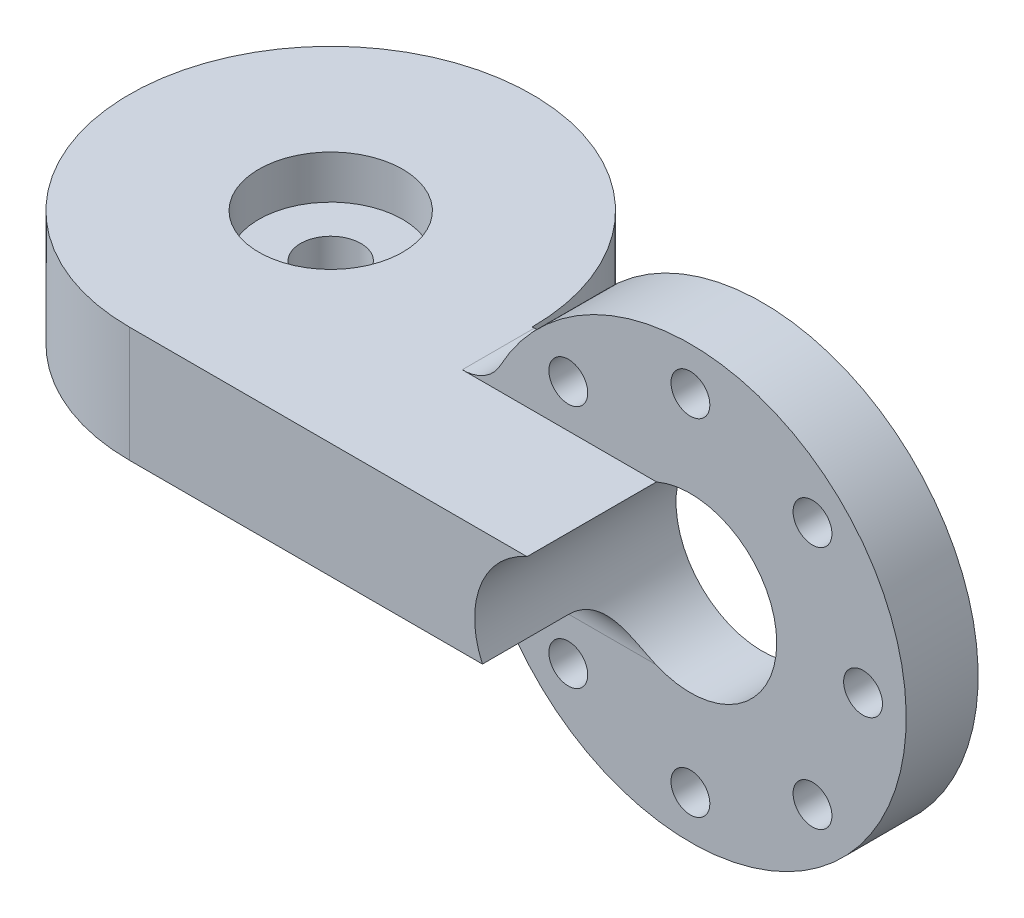
ISO-10303-21;
HEADER;
FILE_DESCRIPTION(('STEP AP214'),'2;1');
FILE_NAME('part.step','',(''),(''),'','','');
FILE_SCHEMA(('AUTOMOTIVE_DESIGN { 1 0 10303 214 1 1 1 1 }'));
ENDSEC;
DATA;
#1=APPLICATION_CONTEXT('core data for automotive mechanical design processes');
#2=APPLICATION_PROTOCOL_DEFINITION('international standard','automotive_design',2000,#1);
#3=PRODUCT_CONTEXT('',#1,'mechanical');
#4=PRODUCT('Part','Part','',(#3));
#5=PRODUCT_RELATED_PRODUCT_CATEGORY('part','',(#4));
#6=PRODUCT_DEFINITION_FORMATION('','',#4);
#7=PRODUCT_DEFINITION_CONTEXT('part definition',#1,'design');
#8=PRODUCT_DEFINITION('design','',#6,#7);
#9=PRODUCT_DEFINITION_SHAPE('','',#8);
#10=(LENGTH_UNIT() NAMED_UNIT(*) SI_UNIT(.MILLI.,.METRE.));
#11=(NAMED_UNIT(*) PLANE_ANGLE_UNIT() SI_UNIT($,.RADIAN.));
#12=(NAMED_UNIT(*) SI_UNIT($,.STERADIAN.) SOLID_ANGLE_UNIT());
#13=UNCERTAINTY_MEASURE_WITH_UNIT(LENGTH_MEASURE(1.E-05),#10,'distance_accuracy_value','');
#14=(GEOMETRIC_REPRESENTATION_CONTEXT(3) GLOBAL_UNCERTAINTY_ASSIGNED_CONTEXT((#13)) GLOBAL_UNIT_ASSIGNED_CONTEXT((#10,
#11,#12)) REPRESENTATION_CONTEXT('',''));
#15=CARTESIAN_POINT('',(0.,0.,0.));
#16=DIRECTION('',(0.,0.,1.));
#17=DIRECTION('',(1.,0.,0.));
#18=AXIS2_PLACEMENT_3D('',#15,#16,#17);
#19=CARTESIAN_POINT('',(0.,0.,0.));
#20=DIRECTION('',(0.,0.,1.));
#21=DIRECTION('',(1.,0.,0.));
#22=AXIS2_PLACEMENT_3D('',#19,#20,#21);
#23=PLANE('',#22);
#24=CARTESIAN_POINT('',(30.,12.,0.));
#25=DIRECTION('',(0.,0.,1.));
#26=DIRECTION('',(1.,0.,0.));
#27=AXIS2_PLACEMENT_3D('',#24,#25,#26);
#28=CIRCLE('',#27,1.35);
#29=CARTESIAN_POINT('',(31.35,12.,0.));
#30=VERTEX_POINT('',#29);
#31=EDGE_CURVE('E171',#30,#30,#28,.T.);
#32=ORIENTED_EDGE('',*,*,#31,.T.);
#33=EDGE_LOOP('',(#32));
#34=FACE_BOUND('',#33,.T.);
#35=CARTESIAN_POINT('',(38.4852813742388,8.48528137423903,0.));
#36=DIRECTION('',(0.,0.,1.));
#37=DIRECTION('',(1.,0.,0.));
#38=AXIS2_PLACEMENT_3D('',#35,#36,#37);
#39=CIRCLE('',#38,1.35);
#40=CARTESIAN_POINT('',(39.8352813742388,8.48528137423903,0.));
#41=VERTEX_POINT('',#40);
#42=EDGE_CURVE('E234',#41,#41,#39,.T.);
#43=ORIENTED_EDGE('',*,*,#42,.T.);
#44=EDGE_LOOP('',(#43));
#45=FACE_BOUND('',#44,.T.);
#46=CARTESIAN_POINT('',(42.0000000000007,6.38378239159465E-13,0.));
#47=DIRECTION('',(0.,0.,1.));
#48=DIRECTION('',(1.,0.,0.));
#49=AXIS2_PLACEMENT_3D('',#46,#47,#48);
#50=CIRCLE('',#49,1.35);
#51=CARTESIAN_POINT('',(43.3500000000007,6.38378239159465E-13,0.));
#52=VERTEX_POINT('',#51);
#53=EDGE_CURVE('E230',#52,#52,#50,.T.);
#54=ORIENTED_EDGE('',*,*,#53,.T.);
#55=EDGE_LOOP('',(#54));
#56=FACE_BOUND('',#55,.T.);
#57=CARTESIAN_POINT('',(38.4852813742397,-8.48528137423813,0.));
#58=DIRECTION('',(0.,0.,1.));
#59=DIRECTION('',(1.,0.,0.));
#60=AXIS2_PLACEMENT_3D('',#57,#58,#59);
#61=CIRCLE('',#60,1.35);
#62=CARTESIAN_POINT('',(39.8352813742397,-8.48528137423813,0.));
#63=VERTEX_POINT('',#62);
#64=EDGE_CURVE('E226',#63,#63,#61,.T.);
#65=ORIENTED_EDGE('',*,*,#64,.T.);
#66=EDGE_LOOP('',(#65));
#67=FACE_BOUND('',#66,.T.);
#68=CARTESIAN_POINT('',(30.0000000000013,-12.,0.));
#69=DIRECTION('',(0.,0.,1.));
#70=DIRECTION('',(1.,0.,0.));
#71=AXIS2_PLACEMENT_3D('',#68,#69,#70);
#72=CIRCLE('',#71,1.35);
#73=CARTESIAN_POINT('',(31.3500000000013,-12.,0.));
#74=VERTEX_POINT('',#73);
#75=EDGE_CURVE('E222',#74,#74,#72,.T.);
#76=ORIENTED_EDGE('',*,*,#75,.T.);
#77=EDGE_LOOP('',(#76));
#78=FACE_BOUND('',#77,.T.);
#79=CARTESIAN_POINT('',(21.5147186257625,-8.48528137423898,0.));
#80=DIRECTION('',(0.,0.,1.));
#81=DIRECTION('',(1.,0.,0.));
#82=AXIS2_PLACEMENT_3D('',#79,#80,#81);
#83=CIRCLE('',#82,1.35);
#84=CARTESIAN_POINT('',(22.8647186257625,-8.48528137423898,0.));
#85=VERTEX_POINT('',#84);
#86=EDGE_CURVE('E218',#85,#85,#83,.T.);
#87=ORIENTED_EDGE('',*,*,#86,.T.);
#88=EDGE_LOOP('',(#87));
#89=FACE_BOUND('',#88,.T.);
#90=CARTESIAN_POINT('',(21.5147186257617,8.48528137423818,0.));
#91=DIRECTION('',(0.,0.,1.));
#92=DIRECTION('',(1.,0.,0.));
#93=AXIS2_PLACEMENT_3D('',#90,#91,#92);
#94=CIRCLE('',#93,1.35);
#95=CARTESIAN_POINT('',(22.8647186257617,8.48528137423818,0.));
#96=VERTEX_POINT('',#95);
#97=EDGE_CURVE('E214',#96,#96,#94,.T.);
#98=ORIENTED_EDGE('',*,*,#97,.T.);
#99=EDGE_LOOP('',(#98));
#100=FACE_BOUND('',#99,.T.);
#101=CARTESIAN_POINT('',(30.,0.,0.));
#102=DIRECTION('',(0.,0.,1.));
#103=DIRECTION('',(1.,0.,0.));
#104=AXIS2_PLACEMENT_3D('',#101,#102,#103);
#105=CIRCLE('',#104,6.);
#106=CARTESIAN_POINT('',(36.,0.,0.));
#107=VERTEX_POINT('',#106);
#108=EDGE_CURVE('E166',#107,#107,#105,.T.);
#109=ORIENTED_EDGE('',*,*,#108,.T.);
#110=EDGE_LOOP('',(#109));
#111=FACE_BOUND('',#110,.T.);
#112=DIRECTION('',(0.,-1.,0.));
#113=VECTOR('',#112,1.);
#114=CARTESIAN_POINT('',(14.,2.5,0.));
#115=LINE('',#114,#113);
#116=CARTESIAN_POINT('',(14.,-2.5,0.));
#117=VERTEX_POINT('',#116);
#118=CARTESIAN_POINT('',(14.,5.517643060859,0.));
#119=VERTEX_POINT('',#118);
#120=EDGE_CURVE('E66',#117,#119,#115,.F.);
#121=ORIENTED_EDGE('',*,*,#120,.T.);
#122=DIRECTION('',(1.,0.,0.));
#123=VECTOR('',#122,1.);
#124=CARTESIAN_POINT('',(0.,5.517643060859,0.));
#125=LINE('',#124,#123);
#126=CARTESIAN_POINT('',(14.1428326398502,5.517643060859,0.));
#127=VERTEX_POINT('',#126);
#128=EDGE_CURVE('E147',#119,#127,#125,.T.);
#129=ORIENTED_EDGE('',*,*,#128,.T.);
#130=CARTESIAN_POINT('',(14.1428326398502,8.517643060859,0.));
#131=DIRECTION('',(0.,0.,1.));
#132=DIRECTION('',(1.,0.,0.));
#133=AXIS2_PLACEMENT_3D('',#130,#131,#132);
#134=CIRCLE('',#133,3.);
#135=CARTESIAN_POINT('',(16.7856938665418,7.09803588404917,0.));
#136=VERTEX_POINT('',#135);
#137=EDGE_CURVE('E271',#127,#136,#134,.T.);
#138=ORIENTED_EDGE('',*,*,#137,.T.);
#139=CARTESIAN_POINT('',(30.,0.,0.));
#140=DIRECTION('',(0.,0.,1.));
#141=DIRECTION('',(1.,0.,0.));
#142=AXIS2_PLACEMENT_3D('',#139,#140,#141);
#143=CIRCLE('',#142,15.);
#144=CARTESIAN_POINT('',(15.3632859412538,-3.28125,0.));
#145=VERTEX_POINT('',#144);
#146=EDGE_CURVE('E206',#145,#136,#143,.T.);
#147=ORIENTED_EDGE('',*,*,#146,.F.);
#148=CARTESIAN_POINT('',(14.387505004004,-3.5,0.));
#149=DIRECTION('',(0.,0.,1.));
#150=DIRECTION('',(1.,0.,0.));
#151=AXIS2_PLACEMENT_3D('',#148,#149,#150);
#152=CIRCLE('',#151,1.);
#153=CARTESIAN_POINT('',(14.387505004004,-2.5,0.));
#154=VERTEX_POINT('',#153);
#155=EDGE_CURVE('E59',#145,#154,#152,.T.);
#156=ORIENTED_EDGE('',*,*,#155,.T.);
#157=DIRECTION('',(-1.,0.,0.));
#158=VECTOR('',#157,1.);
#159=CARTESIAN_POINT('',(0.,-2.5,0.));
#160=LINE('',#159,#158);
#161=EDGE_CURVE('E211',#154,#117,#160,.T.);
#162=ORIENTED_EDGE('',*,*,#161,.T.);
#163=EDGE_LOOP('',(#121,#129,#138,#147,#156,#162));
#164=FACE_BOUND('',#163,.T.);
#165=ADVANCED_FACE('F45',(#34,#45,#56,#67,#78,#89,#100,#111,#164),#23,.F.);
#166=CARTESIAN_POINT('',(0.,2.5,0.));
#167=DIRECTION('',(0.,-1.,0.));
#168=DIRECTION('',(0.,0.,-1.));
#169=AXIS2_PLACEMENT_3D('',#166,#167,#168);
#170=CYLINDRICAL_SURFACE('',#169,2.1);
#171=CARTESIAN_POINT('',(0.,-2.5,0.));
#172=DIRECTION('',(0.,1.,0.));
#173=DIRECTION('',(0.,0.,1.));
#174=AXIS2_PLACEMENT_3D('',#171,#172,#173);
#175=CIRCLE('',#174,2.1);
#176=CARTESIAN_POINT('',(0.,-2.5,2.1));
#177=VERTEX_POINT('',#176);
#178=EDGE_CURVE('E243',#177,#177,#175,.T.);
#179=ORIENTED_EDGE('',*,*,#178,.F.);
#180=EDGE_LOOP('',(#179));
#181=FACE_BOUND('',#180,.T.);
#182=CARTESIAN_POINT('',(0.,2.5,0.));
#183=DIRECTION('',(0.,1.,0.));
#184=DIRECTION('',(0.,0.,1.));
#185=AXIS2_PLACEMENT_3D('',#182,#183,#184);
#186=CIRCLE('',#185,2.1);
#187=CARTESIAN_POINT('',(0.,2.5,2.1));
#188=VERTEX_POINT('',#187);
#189=EDGE_CURVE('E244',#188,#188,#186,.T.);
#190=ORIENTED_EDGE('',*,*,#189,.T.);
#191=EDGE_LOOP('',(#190));
#192=FACE_BOUND('',#191,.T.);
#193=ADVANCED_FACE('F307',(#181,#192),#170,.F.);
#194=CARTESIAN_POINT('',(0.,5.517643060859,5.));
#195=DIRECTION('',(0.,1.,0.));
#196=DIRECTION('',(-1.,0.,0.));
#197=AXIS2_PLACEMENT_3D('',#194,#195,#196);
#198=PLANE('',#197);
#199=ORIENTED_EDGE('',*,*,#128,.F.);
#200=CARTESIAN_POINT('',(0.,5.517643060859,0.));
#201=DIRECTION('',(0.,1.,0.));
#202=DIRECTION('',(-1.,0.,0.));
#203=AXIS2_PLACEMENT_3D('',#200,#201,#202);
#204=CIRCLE('',#203,14.);
#205=CARTESIAN_POINT('',(0.,5.517643060859,14.));
#206=VERTEX_POINT('',#205);
#207=EDGE_CURVE('E126',#119,#206,#204,.T.);
#208=ORIENTED_EDGE('',*,*,#207,.T.);
#209=DIRECTION('',(1.,0.,0.));
#210=VECTOR('',#209,1.);
#211=CARTESIAN_POINT('',(0.,5.517643060859,14.));
#212=LINE('',#211,#210);
#213=CARTESIAN_POINT('',(27.6429647747743,5.517643060859,14.));
#214=VERTEX_POINT('',#213);
#215=EDGE_CURVE('E133',#206,#214,#212,.T.);
#216=ORIENTED_EDGE('',*,*,#215,.T.);
#217=DIRECTION('',(0.,0.,-1.));
#218=VECTOR('',#217,1.);
#219=CARTESIAN_POINT('',(27.6429647747743,5.517643060859,14.));
#220=LINE('',#219,#218);
#221=CARTESIAN_POINT('',(27.6429647747743,5.517643060859,5.));
#222=VERTEX_POINT('',#221);
#223=EDGE_CURVE('E132',#214,#222,#220,.T.);
#224=ORIENTED_EDGE('',*,*,#223,.T.);
#225=DIRECTION('',(-1.,0.,0.));
#226=VECTOR('',#225,1.);
#227=CARTESIAN_POINT('',(0.,5.517643060859,5.));
#228=LINE('',#227,#226);
#229=CARTESIAN_POINT('',(14.1428326398502,5.517643060859,5.));
#230=VERTEX_POINT('',#229);
#231=EDGE_CURVE('E253',#222,#230,#228,.T.);
#232=ORIENTED_EDGE('',*,*,#231,.T.);
#233=DIRECTION('',(0.,0.,-1.));
#234=VECTOR('',#233,1.);
#235=CARTESIAN_POINT('',(14.1428326398502,5.517643060859,5.));
#236=LINE('',#235,#234);
#237=EDGE_CURVE('E260',#230,#127,#236,.T.);
#238=ORIENTED_EDGE('',*,*,#237,.T.);
#239=EDGE_LOOP('',(#199,#208,#216,#224,#232,#238));
#240=FACE_BOUND('',#239,.T.);
#241=CARTESIAN_POINT('',(0.,5.517643060859,0.));
#242=DIRECTION('',(0.,1.,0.));
#243=DIRECTION('',(-1.,0.,0.));
#244=AXIS2_PLACEMENT_3D('',#241,#242,#243);
#245=CIRCLE('',#244,5.);
#246=CARTESIAN_POINT('',(0.,5.517643060859,-5.));
#247=VERTEX_POINT('',#246);
#248=EDGE_CURVE('E256',#247,#247,#245,.F.);
#249=ORIENTED_EDGE('',*,*,#248,.T.);
#250=EDGE_LOOP('',(#249));
#251=FACE_BOUND('',#250,.T.);
#252=ADVANCED_FACE('F144',(#240,#251),#198,.T.);
#253=CARTESIAN_POINT('',(0.,2.5,0.));
#254=DIRECTION('',(0.,-1.,0.));
#255=DIRECTION('',(0.,0.,-1.));
#256=AXIS2_PLACEMENT_3D('',#253,#254,#255);
#257=CYLINDRICAL_SURFACE('',#256,14.);
#258=DIRECTION('',(0.,1.,0.));
#259=VECTOR('',#258,1.);
#260=CARTESIAN_POINT('',(0.,0.,14.));
#261=LINE('',#260,#259);
#262=CARTESIAN_POINT('',(0.,-2.5,14.));
#263=VERTEX_POINT('',#262);
#264=EDGE_CURVE('E122',#263,#206,#261,.T.);
#265=ORIENTED_EDGE('',*,*,#264,.T.);
#266=ORIENTED_EDGE('',*,*,#207,.F.);
#267=ORIENTED_EDGE('',*,*,#120,.F.);
#268=CARTESIAN_POINT('',(0.,-2.5,0.));
#269=DIRECTION('',(0.,1.,0.));
#270=DIRECTION('',(0.,0.,1.));
#271=AXIS2_PLACEMENT_3D('',#268,#269,#270);
#272=CIRCLE('',#271,14.);
#273=EDGE_CURVE('E128',#117,#263,#272,.T.);
#274=ORIENTED_EDGE('',*,*,#273,.T.);
#275=EDGE_LOOP('',(#265,#266,#267,#274));
#276=FACE_BOUND('',#275,.T.);
#277=ADVANCED_FACE('F124',(#276),#257,.T.);
#278=CARTESIAN_POINT('',(0.,2.5,0.));
#279=DIRECTION('',(0.,1.,0.));
#280=DIRECTION('',(0.,0.,1.));
#281=AXIS2_PLACEMENT_3D('',#278,#279,#280);
#282=PLANE('',#281);
#283=CARTESIAN_POINT('',(0.,2.5,0.));
#284=DIRECTION('',(0.,1.,0.));
#285=DIRECTION('',(0.,0.,1.));
#286=AXIS2_PLACEMENT_3D('',#283,#284,#285);
#287=CIRCLE('',#286,5.);
#288=CARTESIAN_POINT('',(0.,2.5,-5.));
#289=VERTEX_POINT('',#288);
#290=EDGE_CURVE('E149',#289,#289,#287,.T.);
#291=ORIENTED_EDGE('',*,*,#290,.T.);
#292=EDGE_LOOP('',(#291));
#293=FACE_BOUND('',#292,.T.);
#294=ORIENTED_EDGE('',*,*,#189,.F.);
#295=EDGE_LOOP('',(#294));
#296=FACE_BOUND('',#295,.T.);
#297=ADVANCED_FACE('F311',(#293,#296),#282,.T.);
#298=CARTESIAN_POINT('',(0.,-2.5,0.));
#299=DIRECTION('',(0.,1.,0.));
#300=DIRECTION('',(0.,0.,1.));
#301=AXIS2_PLACEMENT_3D('',#298,#299,#300);
#302=PLANE('',#301);
#303=ORIENTED_EDGE('',*,*,#178,.T.);
#304=EDGE_LOOP('',(#303));
#305=FACE_BOUND('',#304,.T.);
#306=ORIENTED_EDGE('',*,*,#161,.F.);
#307=DIRECTION('',(0.,0.,1.));
#308=VECTOR('',#307,1.);
#309=CARTESIAN_POINT('',(14.387505004004,-2.5,8.));
#310=LINE('',#309,#308);
#311=CARTESIAN_POINT('',(14.387505004004,-2.5,8.));
#312=VERTEX_POINT('',#311);
#313=EDGE_CURVE('E598',#154,#312,#310,.T.);
#314=ORIENTED_EDGE('',*,*,#313,.T.);
#315=DIRECTION('',(1.,0.,0.));
#316=VECTOR('',#315,1.);
#317=CARTESIAN_POINT('',(0.,-2.5,8.));
#318=LINE('',#317,#316);
#319=CARTESIAN_POINT('',(24.5456439426821,-2.5,8.));
#320=VERTEX_POINT('',#319);
#321=EDGE_CURVE('E73',#312,#320,#318,.T.);
#322=ORIENTED_EDGE('',*,*,#321,.T.);
#323=DIRECTION('',(0.,0.,-1.));
#324=VECTOR('',#323,1.);
#325=CARTESIAN_POINT('',(24.5456439426821,-2.5,14.));
#326=LINE('',#325,#324);
#327=CARTESIAN_POINT('',(24.5456439426821,-2.5,14.));
#328=VERTEX_POINT('',#327);
#329=EDGE_CURVE('E162',#328,#320,#326,.T.);
#330=ORIENTED_EDGE('',*,*,#329,.F.);
#331=DIRECTION('',(-1.,0.,0.));
#332=VECTOR('',#331,1.);
#333=CARTESIAN_POINT('',(0.,-2.5,14.));
#334=LINE('',#333,#332);
#335=EDGE_CURVE('E153',#328,#263,#334,.T.);
#336=ORIENTED_EDGE('',*,*,#335,.T.);
#337=ORIENTED_EDGE('',*,*,#273,.F.);
#338=EDGE_LOOP('',(#306,#314,#322,#330,#336,#337));
#339=FACE_BOUND('',#338,.T.);
#340=ADVANCED_FACE('F314',(#305,#339),#302,.F.);
#341=CARTESIAN_POINT('',(30.,0.,5.));
#342=DIRECTION('',(0.,0.,-1.));
#343=DIRECTION('',(-1.,0.,0.));
#344=AXIS2_PLACEMENT_3D('',#341,#342,#343);
#345=CYLINDRICAL_SURFACE('',#344,15.);
#346=CARTESIAN_POINT('',(16.0447142630471,-5.5,5.));
#347=CARTESIAN_POINT('',(16.0117942986081,-5.41649106568859,4.99999355003017));
#348=CARTESIAN_POINT('',(15.9796340228716,-5.33267312864883,5.00348731812164));
#349=CARTESIAN_POINT('',(15.9169969388175,-5.16497654456146,5.01757931999082));
#350=CARTESIAN_POINT('',(15.8865206747405,-5.08109788666047,5.02817983616623));
#351=CARTESIAN_POINT('',(15.8273925124051,-4.9137654369234,5.05661093087854));
#352=CARTESIAN_POINT('',(15.7987434360146,-4.83031247703287,5.07445239357447));
#353=CARTESIAN_POINT('',(15.7434671279547,-4.66464515374485,5.11737685616325));
#354=CARTESIAN_POINT('',(15.7168396625155,-4.58243064802222,5.14245901715929));
#355=CARTESIAN_POINT('',(15.6400288752613,-4.33822989572999,5.22870833886146));
#356=CARTESIAN_POINT('',(15.5930068507227,-4.17894212772704,5.30083570713452));
#357=CARTESIAN_POINT('',(15.5079832041415,-3.87383528076327,5.47289612400084));
#358=CARTESIAN_POINT('',(15.4699710922403,-3.72800066096201,5.57279654009513));
#359=CARTESIAN_POINT('',(15.4042168539788,-3.46137427054744,5.79263716577192));
#360=CARTESIAN_POINT('',(15.376078969002,-3.33973266365101,5.91142778986856));
#361=CARTESIAN_POINT('',(15.3271262217739,-3.11765178631283,6.1687962009127));
#362=CARTESIAN_POINT('',(15.3063135943589,-3.01721899012217,6.30738000839441));
#363=CARTESIAN_POINT('',(15.2717186338166,-2.8434820467438,6.5962307762745));
#364=CARTESIAN_POINT('',(15.2577618270153,-2.76951927314753,6.74608182149099));
#365=CARTESIAN_POINT('',(15.2353470191564,-2.64743322714679,7.05628748156518));
#366=CARTESIAN_POINT('',(15.2268848357065,-2.59929030608037,7.21663400489674));
#367=CARTESIAN_POINT('',(15.2171623718744,-2.54326155192738,7.48175528188588));
#368=CARTESIAN_POINT('',(15.2143909954658,-2.52704758161222,7.58479205383505));
#369=CARTESIAN_POINT('',(15.2107163277298,-2.50541934834899,7.79187091616561));
#370=CARTESIAN_POINT('',(15.2098102681688,-2.49998908221112,7.89591128626156));
#371=CARTESIAN_POINT('',(15.209800542251,-2.5,8.));
#372=B_SPLINE_CURVE_WITH_KNOTS('',3,(#346,#347,#348,#349,#350,#351,#352,#353,#354,#355,#356,
#357,#358,#359,#360,#361,#362,#363,#364,#365,#366,#367,#368,#369,#370,#371),.UNSPECIFIED.,.F.,
.F.,(4,2,2,2,2,2,2,2,2,2,2,2,4),(0.,0.269230160302886,0.538546827803067,0.808269824307295,
1.07796158362961,1.61815735092223,2.15772106758129,2.67216333710194,3.18676242018573,
3.68748230042939,4.1878205949873,4.50031055528965,4.8123364278971),.UNSPECIFIED.);
#373=CARTESIAN_POINT('',(16.0447142630471,-5.5,5.));
#374=VERTEX_POINT('',#373);
#375=CARTESIAN_POINT('',(15.3632859412538,-3.28125,5.98080500260624));
#376=VERTEX_POINT('',#375);
#377=EDGE_CURVE('E287',#374,#376,#372,.T.);
#378=ORIENTED_EDGE('',*,*,#377,.T.);
#379=DIRECTION('',(0.,0.,-1.));
#380=VECTOR('',#379,1.);
#381=CARTESIAN_POINT('',(15.3632859412538,-3.28125,5.));
#382=LINE('',#381,#380);
#383=EDGE_CURVE('E600',#376,#145,#382,.T.);
#384=ORIENTED_EDGE('',*,*,#383,.T.);
#385=ORIENTED_EDGE('',*,*,#146,.T.);
#386=DIRECTION('',(0.,0.,-1.));
#387=VECTOR('',#386,1.);
#388=CARTESIAN_POINT('',(16.7856938665418,7.09803588404917,5.));
#389=LINE('',#388,#387);
#390=CARTESIAN_POINT('',(16.7856938665418,7.09803588404917,5.));
#391=VERTEX_POINT('',#390);
#392=EDGE_CURVE('E263',#136,#391,#389,.F.);
#393=ORIENTED_EDGE('',*,*,#392,.T.);
#394=CARTESIAN_POINT('',(30.,0.,5.));
#395=DIRECTION('',(0.,0.,1.));
#396=DIRECTION('',(1.,0.,0.));
#397=AXIS2_PLACEMENT_3D('',#394,#395,#396);
#398=CIRCLE('',#397,15.);
#399=EDGE_CURVE('E170',#374,#391,#398,.T.);
#400=ORIENTED_EDGE('',*,*,#399,.F.);
#401=EDGE_LOOP('',(#378,#384,#385,#393,#400));
#402=FACE_BOUND('',#401,.T.);
#403=ADVANCED_FACE('F304',(#402),#345,.T.);
#404=CARTESIAN_POINT('',(38.4852813742388,8.48528137423903,5.));
#405=DIRECTION('',(0.,0.,-1.));
#406=DIRECTION('',(-1.,0.,0.));
#407=AXIS2_PLACEMENT_3D('',#404,#405,#406);
#408=CYLINDRICAL_SURFACE('',#407,1.35);
#409=CARTESIAN_POINT('',(38.4852813742388,8.48528137423903,5.));
#410=DIRECTION('',(0.,0.,1.));
#411=DIRECTION('',(1.,0.,0.));
#412=AXIS2_PLACEMENT_3D('',#409,#410,#411);
#413=CIRCLE('',#412,1.35);
#414=CARTESIAN_POINT('',(39.8352813742388,8.48528137423903,5.));
#415=VERTEX_POINT('',#414);
#416=EDGE_CURVE('E195',#415,#415,#413,.T.);
#417=ORIENTED_EDGE('',*,*,#416,.T.);
#418=EDGE_LOOP('',(#417));
#419=FACE_BOUND('',#418,.T.);
#420=ORIENTED_EDGE('',*,*,#42,.F.);
#421=EDGE_LOOP('',(#420));
#422=FACE_BOUND('',#421,.T.);
#423=ADVANCED_FACE('F344',(#419,#422),#408,.F.);
#424=CARTESIAN_POINT('',(42.0000000000007,6.38378239159465E-13,5.));
#425=DIRECTION('',(0.,0.,-1.));
#426=DIRECTION('',(-1.,0.,0.));
#427=AXIS2_PLACEMENT_3D('',#424,#425,#426);
#428=CYLINDRICAL_SURFACE('',#427,1.35);
#429=CARTESIAN_POINT('',(42.0000000000007,6.38378239159465E-13,5.));
#430=DIRECTION('',(0.,0.,1.));
#431=DIRECTION('',(1.,0.,0.));
#432=AXIS2_PLACEMENT_3D('',#429,#430,#431);
#433=CIRCLE('',#432,1.35);
#434=CARTESIAN_POINT('',(43.3500000000007,6.38378239159465E-13,5.));
#435=VERTEX_POINT('',#434);
#436=EDGE_CURVE('E191',#435,#435,#433,.T.);
#437=ORIENTED_EDGE('',*,*,#436,.T.);
#438=EDGE_LOOP('',(#437));
#439=FACE_BOUND('',#438,.T.);
#440=ORIENTED_EDGE('',*,*,#53,.F.);
#441=EDGE_LOOP('',(#440));
#442=FACE_BOUND('',#441,.T.);
#443=ADVANCED_FACE('F347',(#439,#442),#428,.F.);
#444=CARTESIAN_POINT('',(38.4852813742397,-8.48528137423813,5.));
#445=DIRECTION('',(0.,0.,-1.));
#446=DIRECTION('',(-1.,0.,0.));
#447=AXIS2_PLACEMENT_3D('',#444,#445,#446);
#448=CYLINDRICAL_SURFACE('',#447,1.35);
#449=CARTESIAN_POINT('',(38.4852813742397,-8.48528137423813,5.));
#450=DIRECTION('',(0.,0.,1.));
#451=DIRECTION('',(1.,0.,0.));
#452=AXIS2_PLACEMENT_3D('',#449,#450,#451);
#453=CIRCLE('',#452,1.35);
#454=CARTESIAN_POINT('',(39.8352813742397,-8.48528137423813,5.));
#455=VERTEX_POINT('',#454);
#456=EDGE_CURVE('E187',#455,#455,#453,.T.);
#457=ORIENTED_EDGE('',*,*,#456,.T.);
#458=EDGE_LOOP('',(#457));
#459=FACE_BOUND('',#458,.T.);
#460=ORIENTED_EDGE('',*,*,#64,.F.);
#461=EDGE_LOOP('',(#460));
#462=FACE_BOUND('',#461,.T.);
#463=ADVANCED_FACE('F351',(#459,#462),#448,.F.);
#464=CARTESIAN_POINT('',(30.0000000000013,-12.,5.));
#465=DIRECTION('',(0.,0.,-1.));
#466=DIRECTION('',(-1.,0.,0.));
#467=AXIS2_PLACEMENT_3D('',#464,#465,#466);
#468=CYLINDRICAL_SURFACE('',#467,1.35);
#469=CARTESIAN_POINT('',(30.0000000000013,-12.,5.));
#470=DIRECTION('',(0.,0.,1.));
#471=DIRECTION('',(1.,0.,0.));
#472=AXIS2_PLACEMENT_3D('',#469,#470,#471);
#473=CIRCLE('',#472,1.35);
#474=CARTESIAN_POINT('',(31.3500000000013,-12.,5.));
#475=VERTEX_POINT('',#474);
#476=EDGE_CURVE('E183',#475,#475,#473,.T.);
#477=ORIENTED_EDGE('',*,*,#476,.T.);
#478=EDGE_LOOP('',(#477));
#479=FACE_BOUND('',#478,.T.);
#480=ORIENTED_EDGE('',*,*,#75,.F.);
#481=EDGE_LOOP('',(#480));
#482=FACE_BOUND('',#481,.T.);
#483=ADVANCED_FACE('F355',(#479,#482),#468,.F.);
#484=CARTESIAN_POINT('',(21.5147186257625,-8.48528137423898,5.));
#485=DIRECTION('',(0.,0.,-1.));
#486=DIRECTION('',(-1.,0.,0.));
#487=AXIS2_PLACEMENT_3D('',#484,#485,#486);
#488=CYLINDRICAL_SURFACE('',#487,1.35);
#489=CARTESIAN_POINT('',(21.5147186257625,-8.48528137423898,5.));
#490=DIRECTION('',(0.,0.,1.));
#491=DIRECTION('',(1.,0.,0.));
#492=AXIS2_PLACEMENT_3D('',#489,#490,#491);
#493=CIRCLE('',#492,1.35);
#494=CARTESIAN_POINT('',(22.8647186257625,-8.48528137423898,5.));
#495=VERTEX_POINT('',#494);
#496=EDGE_CURVE('E179',#495,#495,#493,.T.);
#497=ORIENTED_EDGE('',*,*,#496,.T.);
#498=EDGE_LOOP('',(#497));
#499=FACE_BOUND('',#498,.T.);
#500=ORIENTED_EDGE('',*,*,#86,.F.);
#501=EDGE_LOOP('',(#500));
#502=FACE_BOUND('',#501,.T.);
#503=ADVANCED_FACE('F359',(#499,#502),#488,.F.);
#504=CARTESIAN_POINT('',(21.5147186257617,8.48528137423818,5.));
#505=DIRECTION('',(0.,0.,-1.));
#506=DIRECTION('',(-1.,0.,0.));
#507=AXIS2_PLACEMENT_3D('',#504,#505,#506);
#508=CYLINDRICAL_SURFACE('',#507,1.35);
#509=CARTESIAN_POINT('',(21.5147186257617,8.48528137423818,5.));
#510=DIRECTION('',(0.,0.,1.));
#511=DIRECTION('',(1.,0.,0.));
#512=AXIS2_PLACEMENT_3D('',#509,#510,#511);
#513=CIRCLE('',#512,1.35);
#514=CARTESIAN_POINT('',(22.8647186257617,8.48528137423818,5.));
#515=VERTEX_POINT('',#514);
#516=EDGE_CURVE('E175',#515,#515,#513,.T.);
#517=ORIENTED_EDGE('',*,*,#516,.T.);
#518=EDGE_LOOP('',(#517));
#519=FACE_BOUND('',#518,.T.);
#520=ORIENTED_EDGE('',*,*,#97,.F.);
#521=EDGE_LOOP('',(#520));
#522=FACE_BOUND('',#521,.T.);
#523=ADVANCED_FACE('F302',(#519,#522),#508,.F.);
#524=CARTESIAN_POINT('',(30.,0.,5.));
#525=DIRECTION('',(0.,0.,-1.));
#526=DIRECTION('',(-1.,0.,0.));
#527=AXIS2_PLACEMENT_3D('',#524,#525,#526);
#528=CYLINDRICAL_SURFACE('',#527,6.);
#529=ORIENTED_EDGE('',*,*,#108,.F.);
#530=EDGE_LOOP('',(#529));
#531=FACE_BOUND('',#530,.T.);
#532=ORIENTED_EDGE('',*,*,#329,.T.);
#533=CARTESIAN_POINT('',(24.5456439426821,-2.5,8.));
#534=CARTESIAN_POINT('',(24.5456510961518,-2.49998944052665,7.92342882101416));
#535=CARTESIAN_POINT('',(24.5469878886873,-2.50293144647683,7.84686064730047));
#536=CARTESIAN_POINT('',(24.5523715210248,-2.51464114724023,7.69426864182748));
#537=CARTESIAN_POINT('',(24.5564182993123,-2.52340870981783,7.61824479775192));
#538=CARTESIAN_POINT('',(24.5672687494696,-2.5466816837769,7.46733075923317));
#539=CARTESIAN_POINT('',(24.5740704287001,-2.5611829477516,7.39243978590546));
#540=CARTESIAN_POINT('',(24.5905197777855,-2.59574390927201,7.2442934590508));
#541=CARTESIAN_POINT('',(24.6001673885465,-2.61580349140225,7.17103807159592));
#542=CARTESIAN_POINT('',(24.6335778069035,-2.68404950539388,6.95439902762841));
#543=CARTESIAN_POINT('',(24.661809727163,-2.74030673927305,6.81411997305423));
#544=CARTESIAN_POINT('',(24.7312385683598,-2.87151788241341,6.54626527005188));
#545=CARTESIAN_POINT('',(24.7724290255317,-2.94646246649887,6.41868332993006));
#546=CARTESIAN_POINT('',(24.8686745395476,-3.11103411420532,6.17960238341687));
#547=CARTESIAN_POINT('',(24.9237015745606,-3.20063137653151,6.0680715795647));
#548=CARTESIAN_POINT('',(25.0480705748473,-3.38986527872654,5.86298749400687));
#549=CARTESIAN_POINT('',(25.1174158888613,-3.48950426434478,5.7694384277472));
#550=CARTESIAN_POINT('',(25.2726549089829,-3.6972389970014,5.59816533513138));
#551=CARTESIAN_POINT('',(25.359036757926,-3.80550787491069,5.5210981679361));
#552=CARTESIAN_POINT('',(25.545480441817,-4.0221477550079,5.38613919979194));
#553=CARTESIAN_POINT('',(25.645545997176,-4.13051877698198,5.32825262848495));
#554=CARTESIAN_POINT('',(25.8276544628916,-4.31314370795642,5.24346789314976));
#555=CARTESIAN_POINT('',(25.9068314222499,-4.3884070644347,5.21243397232628));
#556=CARTESIAN_POINT('',(26.0707010469944,-4.53571836665856,5.15811269928305));
#557=CARTESIAN_POINT('',(26.1553960206301,-4.60776494527369,5.13482861411279));
#558=CARTESIAN_POINT('',(26.3298411564889,-4.74789322693048,5.09489062951732));
#559=CARTESIAN_POINT('',(26.419603852786,-4.81596416892966,5.07825407203319));
#560=CARTESIAN_POINT('',(26.6034054759567,-4.94731402943297,5.05058597550431));
#561=CARTESIAN_POINT('',(26.6974455903334,-5.01059160403872,5.03955600344369));
#562=CARTESIAN_POINT('',(26.9225939767104,-5.15295342991802,5.01899635775498));
#563=CARTESIAN_POINT('',(27.0552351468844,-5.22989695387925,5.01131749743614));
#564=CARTESIAN_POINT('',(27.2579171459459,-5.33730167794008,5.00420259880537));
#565=CARTESIAN_POINT('',(27.3258640879995,-5.37166628129042,5.00256307853914));
#566=CARTESIAN_POINT('',(27.4630392717222,-5.43779586095982,5.00046307425763));
#567=CARTESIAN_POINT('',(27.5322676528395,-5.46956055228899,5.00000271932968));
#568=CARTESIAN_POINT('',(27.6020842383436,-5.5,5.));
#569=B_SPLINE_CURVE_WITH_KNOTS('',3,(#533,#534,#535,#536,#537,#538,#539,#540,#541,#542,#543,
#544,#545,#546,#547,#548,#549,#550,#551,#552,#553,#554,#555,#556,#557,#558,#559,#560,#561,#562,
#563,#564,#565,#566,#567,#568),.UNSPECIFIED.,.F.,.F.,(4,2,2,2,2,2,2,2,2,2,2,2,2,2,2,2,2,4),(0.,
0.229639864720265,0.45927451697198,0.68874336863097,0.918207455850409,1.37706796845856,
1.83569996169567,2.29341051088696,2.75122823032176,3.22483138283266,3.6985635584853,
4.03881773003636,4.3792151592589,4.7204949019629,5.06186997654163,5.52178055395645,
5.75021044818981,5.97866534837254),.UNSPECIFIED.);
#570=CARTESIAN_POINT('',(27.6020842383436,-5.5,5.));
#571=VERTEX_POINT('',#570);
#572=EDGE_CURVE('E279',#320,#571,#569,.T.);
#573=ORIENTED_EDGE('',*,*,#572,.T.);
#574=CARTESIAN_POINT('',(30.,0.,5.));
#575=DIRECTION('',(0.,0.,1.));
#576=DIRECTION('',(1.,0.,0.));
#577=AXIS2_PLACEMENT_3D('',#574,#575,#576);
#578=CIRCLE('',#577,6.);
#579=EDGE_CURVE('E167',#571,#222,#578,.T.);
#580=ORIENTED_EDGE('',*,*,#579,.T.);
#581=ORIENTED_EDGE('',*,*,#223,.F.);
#582=CARTESIAN_POINT('',(30.,0.,14.));
#583=DIRECTION('',(0.,0.,1.));
#584=DIRECTION('',(1.,0.,0.));
#585=AXIS2_PLACEMENT_3D('',#582,#583,#584);
#586=CIRCLE('',#585,6.);
#587=EDGE_CURVE('E139',#214,#328,#586,.T.);
#588=ORIENTED_EDGE('',*,*,#587,.T.);
#589=EDGE_LOOP('',(#532,#573,#580,#581,#588));
#590=FACE_BOUND('',#589,.T.);
#591=ADVANCED_FACE('F297',(#531,#590),#528,.F.);
#592=CARTESIAN_POINT('',(30.,12.,5.));
#593=DIRECTION('',(0.,0.,-1.));
#594=DIRECTION('',(-1.,0.,0.));
#595=AXIS2_PLACEMENT_3D('',#592,#593,#594);
#596=CYLINDRICAL_SURFACE('',#595,1.35);
#597=CARTESIAN_POINT('',(30.,12.,5.));
#598=DIRECTION('',(0.,0.,1.));
#599=DIRECTION('',(1.,0.,0.));
#600=AXIS2_PLACEMENT_3D('',#597,#598,#599);
#601=CIRCLE('',#600,1.35);
#602=CARTESIAN_POINT('',(31.35,12.,5.));
#603=VERTEX_POINT('',#602);
#604=EDGE_CURVE('E199',#603,#603,#601,.T.);
#605=ORIENTED_EDGE('',*,*,#604,.T.);
#606=EDGE_LOOP('',(#605));
#607=FACE_BOUND('',#606,.T.);
#608=ORIENTED_EDGE('',*,*,#31,.F.);
#609=EDGE_LOOP('',(#608));
#610=FACE_BOUND('',#609,.T.);
#611=ADVANCED_FACE('F301',(#607,#610),#596,.F.);
#612=CARTESIAN_POINT('',(0.,0.,5.));
#613=DIRECTION('',(0.,0.,1.));
#614=DIRECTION('',(1.,0.,0.));
#615=AXIS2_PLACEMENT_3D('',#612,#613,#614);
#616=PLANE('',#615);
#617=ORIENTED_EDGE('',*,*,#579,.F.);
#618=DIRECTION('',(1.,0.,0.));
#619=VECTOR('',#618,1.);
#620=CARTESIAN_POINT('',(0.,-5.5,5.));
#621=LINE('',#620,#619);
#622=EDGE_CURVE('E268',#571,#374,#621,.F.);
#623=ORIENTED_EDGE('',*,*,#622,.T.);
#624=ORIENTED_EDGE('',*,*,#399,.T.);
#625=CARTESIAN_POINT('',(14.1428326398502,8.517643060859,5.));
#626=DIRECTION('',(0.,0.,1.));
#627=DIRECTION('',(1.,0.,0.));
#628=AXIS2_PLACEMENT_3D('',#625,#626,#627);
#629=CIRCLE('',#628,3.);
#630=EDGE_CURVE('E275',#391,#230,#629,.F.);
#631=ORIENTED_EDGE('',*,*,#630,.T.);
#632=ORIENTED_EDGE('',*,*,#231,.F.);
#633=EDGE_LOOP('',(#617,#623,#624,#631,#632));
#634=FACE_BOUND('',#633,.T.);
#635=ORIENTED_EDGE('',*,*,#516,.F.);
#636=EDGE_LOOP('',(#635));
#637=FACE_BOUND('',#636,.T.);
#638=ORIENTED_EDGE('',*,*,#496,.F.);
#639=EDGE_LOOP('',(#638));
#640=FACE_BOUND('',#639,.T.);
#641=ORIENTED_EDGE('',*,*,#476,.F.);
#642=EDGE_LOOP('',(#641));
#643=FACE_BOUND('',#642,.T.);
#644=ORIENTED_EDGE('',*,*,#456,.F.);
#645=EDGE_LOOP('',(#644));
#646=FACE_BOUND('',#645,.T.);
#647=ORIENTED_EDGE('',*,*,#436,.F.);
#648=EDGE_LOOP('',(#647));
#649=FACE_BOUND('',#648,.T.);
#650=ORIENTED_EDGE('',*,*,#416,.F.);
#651=EDGE_LOOP('',(#650));
#652=FACE_BOUND('',#651,.T.);
#653=ORIENTED_EDGE('',*,*,#604,.F.);
#654=EDGE_LOOP('',(#653));
#655=FACE_BOUND('',#654,.T.);
#656=ADVANCED_FACE('F339',(#634,#637,#640,#643,#646,#649,#652,#655),#616,.T.);
#657=CARTESIAN_POINT('',(0.,0.,14.));
#658=DIRECTION('',(0.,0.,1.));
#659=DIRECTION('',(1.,0.,0.));
#660=AXIS2_PLACEMENT_3D('',#657,#658,#659);
#661=PLANE('',#660);
#662=ORIENTED_EDGE('',*,*,#335,.F.);
#663=ORIENTED_EDGE('',*,*,#587,.F.);
#664=ORIENTED_EDGE('',*,*,#215,.F.);
#665=ORIENTED_EDGE('',*,*,#264,.F.);
#666=EDGE_LOOP('',(#662,#663,#664,#665));
#667=FACE_BOUND('',#666,.T.);
#668=ADVANCED_FACE('F137',(#667),#661,.T.);
#669=CARTESIAN_POINT('',(0.,15.,0.));
#670=DIRECTION('',(0.,-1.,0.));
#671=DIRECTION('',(0.,0.,-1.));
#672=AXIS2_PLACEMENT_3D('',#669,#670,#671);
#673=CYLINDRICAL_SURFACE('',#672,5.);
#674=CARTESIAN_POINT('',(0.,2.5,-5.));
#675=CARTESIAN_POINT('',(0.,2.53143378188395,-5.));
#676=CARTESIAN_POINT('',(0.,2.5628675637679,-5.));
#677=CARTESIAN_POINT('',(0.,2.62573512753579,-5.));
#678=CARTESIAN_POINT('',(0.,2.65716890941974,-5.));
#679=CARTESIAN_POINT('',(0.,2.72003647318764,-5.));
#680=CARTESIAN_POINT('',(0.,2.75147025507158,-5.));
#681=CARTESIAN_POINT('',(0.,2.81433781883948,-5.));
#682=CARTESIAN_POINT('',(0.,2.84577160072343,-5.));
#683=CARTESIAN_POINT('',(0.,2.90863916449132,-5.));
#684=CARTESIAN_POINT('',(0.,2.94007294637527,-5.));
#685=CARTESIAN_POINT('',(0.,3.00294051014317,-5.));
#686=CARTESIAN_POINT('',(0.,3.03437429202712,-5.));
#687=CARTESIAN_POINT('',(0.,3.09724185579501,-5.));
#688=CARTESIAN_POINT('',(0.,3.12867563767896,-5.));
#689=CARTESIAN_POINT('',(0.,3.19154320144685,-5.));
#690=CARTESIAN_POINT('',(0.,3.2229769833308,-5.));
#691=CARTESIAN_POINT('',(0.,3.2858445470987,-5.));
#692=CARTESIAN_POINT('',(0.,3.31727832898265,-5.));
#693=CARTESIAN_POINT('',(0.,3.38014589275054,-5.));
#694=CARTESIAN_POINT('',(0.,3.41157967463449,-5.));
#695=CARTESIAN_POINT('',(0.,3.47444723840239,-5.));
#696=CARTESIAN_POINT('',(0.,3.50588102028633,-5.));
#697=CARTESIAN_POINT('',(0.,3.56874858405423,-5.));
#698=CARTESIAN_POINT('',(0.,3.60018236593818,-5.));
#699=CARTESIAN_POINT('',(0.,3.66304992970607,-5.));
#700=CARTESIAN_POINT('',(0.,3.69448371159002,-5.));
#701=CARTESIAN_POINT('',(0.,3.75735127535792,-5.));
#702=CARTESIAN_POINT('',(0.,3.78878505724186,-5.));
#703=CARTESIAN_POINT('',(0.,3.85165262100976,-5.));
#704=CARTESIAN_POINT('',(0.,3.88308640289371,-5.));
#705=CARTESIAN_POINT('',(0.,3.9459539666616,-5.));
#706=CARTESIAN_POINT('',(0.,3.97738774854555,-5.));
#707=CARTESIAN_POINT('',(0.,4.04025531231345,-5.));
#708=CARTESIAN_POINT('',(0.,4.0716890941974,-5.));
#709=CARTESIAN_POINT('',(0.,4.13455665796529,-5.));
#710=CARTESIAN_POINT('',(0.,4.16599043984924,-5.));
#711=CARTESIAN_POINT('',(0.,4.22885800361714,-5.));
#712=CARTESIAN_POINT('',(0.,4.26029178550108,-5.));
#713=CARTESIAN_POINT('',(0.,4.32315934926898,-5.));
#714=CARTESIAN_POINT('',(0.,4.35459313115293,-5.));
#715=CARTESIAN_POINT('',(0.,4.41746069492082,-5.));
#716=CARTESIAN_POINT('',(0.,4.44889447680477,-5.));
#717=CARTESIAN_POINT('',(0.,4.51176204057267,-5.));
#718=CARTESIAN_POINT('',(0.,4.54319582245661,-5.));
#719=CARTESIAN_POINT('',(0.,4.60606338622451,-5.));
#720=CARTESIAN_POINT('',(0.,4.63749716810846,-5.));
#721=CARTESIAN_POINT('',(0.,4.70036473187635,-5.));
#722=CARTESIAN_POINT('',(0.,4.7317985137603,-5.));
#723=CARTESIAN_POINT('',(0.,4.7946660775282,-5.));
#724=CARTESIAN_POINT('',(0.,4.82609985941215,-5.));
#725=CARTESIAN_POINT('',(0.,4.88896742318004,-5.));
#726=CARTESIAN_POINT('',(0.,4.92040120506399,-5.));
#727=CARTESIAN_POINT('',(0.,4.98326876883189,-5.));
#728=CARTESIAN_POINT('',(0.,5.01470255071583,-5.));
#729=CARTESIAN_POINT('',(0.,5.07757011448373,-5.));
#730=CARTESIAN_POINT('',(0.,5.10900389636768,-5.));
#731=CARTESIAN_POINT('',(0.,5.17187146013557,-5.));
#732=CARTESIAN_POINT('',(0.,5.20330524201952,-5.));
#733=CARTESIAN_POINT('',(0.,5.26617280578742,-5.));
#734=CARTESIAN_POINT('',(0.,5.29760658767136,-5.));
#735=CARTESIAN_POINT('',(0.,5.36047415143926,-5.));
#736=CARTESIAN_POINT('',(0.,5.39190793332321,-5.));
#737=CARTESIAN_POINT('',(0.,5.4547754970911,-5.));
#738=CARTESIAN_POINT('',(0.,5.48620927897505,-5.));
#739=CARTESIAN_POINT('',(0.,5.517643060859,-5.));
#740=B_SPLINE_CURVE_WITH_KNOTS('',3,(#674,#675,#676,#677,#678,#679,#680,#681,#682,#683,#684,
#685,#686,#687,#688,#689,#690,#691,#692,#693,#694,#695,#696,#697,#698,#699,#700,#701,#702,#703,
#704,#705,#706,#707,#708,#709,#710,#711,#712,#713,#714,#715,#716,#717,#718,#719,#720,#721,#722,
#723,#724,#725,#726,#727,#728,#729,#730,#731,#732,#733,#734,#735,#736,#737,#738,#739),
.UNSPECIFIED.,.F.,.F.,(4,2,2,2,2,2,2,2,2,2,2,2,2,2,2,2,2,2,2,2,2,2,2,2,2,2,2,2,2,2,2,2,4),(0.,
0.0943013456518437,0.188602691303687,0.282904036955531,0.377205382607375,0.471506728259219,
0.565808073911062,0.660109419562906,0.75441076521475,0.848712110866593,0.943013456518437,
1.03731480217028,1.13161614782212,1.22591749347397,1.32021883912581,1.41452018477766,
1.5088215304295,1.60312287608134,1.69742422173319,1.79172556738503,1.88602691303687,
1.98032825868872,2.07462960434056,2.16893094999241,2.26323229564425,2.35753364129609,
2.45183498694794,2.54613633259978,2.64043767825162,2.73473902390347,2.82904036955531,
2.92334171520716,3.017643060859),.UNSPECIFIED.);
#741=EDGE_CURVE('BSEAM322',#289,#247,#740,.T.);
#742=ORIENTED_EDGE('',*,*,#290,.F.);
#743=ORIENTED_EDGE('',*,*,#248,.F.);
#744=ORIENTED_EDGE('',*,*,#741,.T.);
#745=ORIENTED_EDGE('',*,*,#741,.F.);
#746=EDGE_LOOP('',(#742,#744,#743,#745));
#747=FACE_BOUND('',#746,.T.);
#748=ADVANCED_FACE('F322',(#747),#673,.F.);
#749=CARTESIAN_POINT('',(14.1428326398502,8.517643060859,5.));
#750=DIRECTION('',(0.,0.,-1.));
#751=DIRECTION('',(-1.,0.,0.));
#752=AXIS2_PLACEMENT_3D('',#749,#750,#751);
#753=CYLINDRICAL_SURFACE('',#752,3.);
#754=ORIENTED_EDGE('',*,*,#630,.F.);
#755=ORIENTED_EDGE('',*,*,#392,.F.);
#756=ORIENTED_EDGE('',*,*,#137,.F.);
#757=ORIENTED_EDGE('',*,*,#237,.F.);
#758=EDGE_LOOP('',(#754,#755,#756,#757));
#759=FACE_BOUND('',#758,.T.);
#760=ADVANCED_FACE('F320',(#759),#753,.F.);
#761=CARTESIAN_POINT('',(0.,-5.5,8.));
#762=DIRECTION('',(1.,0.,0.));
#763=DIRECTION('',(0.,0.,-1.));
#764=AXIS2_PLACEMENT_3D('',#761,#762,#763);
#765=CYLINDRICAL_SURFACE('',#764,3.);
#766=ORIENTED_EDGE('',*,*,#377,.F.);
#767=ORIENTED_EDGE('',*,*,#622,.F.);
#768=ORIENTED_EDGE('',*,*,#572,.F.);
#769=ORIENTED_EDGE('',*,*,#321,.F.);
#770=CARTESIAN_POINT('',(15.3632859412538,-3.28125,5.98080500260624));
#771=CARTESIAN_POINT('',(15.3540676618497,-3.24021395663562,6.02588908888145));
#772=CARTESIAN_POINT('',(15.3425412092923,-3.2008333316522,6.07192943172903));
#773=CARTESIAN_POINT('',(15.3155976460261,-3.12550078547506,6.16551196251804));
#774=CARTESIAN_POINT('',(15.3001877245268,-3.08954269599522,6.21305123485533));
#775=CARTESIAN_POINT('',(15.2662715536327,-3.02123877435984,6.30908415272164));
#776=CARTESIAN_POINT('',(15.2477855210823,-2.98887151777116,6.35756985239682));
#777=CARTESIAN_POINT('',(15.2081771558231,-2.92743197182068,6.45557750089963));
#778=CARTESIAN_POINT('',(15.1870531086948,-2.89836184889368,6.50510010602043));
#779=CARTESIAN_POINT('',(15.1320326517906,-2.830373090847,6.62880424321293));
#780=CARTESIAN_POINT('',(15.0968518837609,-2.79337519150265,6.70347497501141));
#781=CARTESIAN_POINT('',(15.0229372880121,-2.72622992781452,6.85413440158372));
#782=CARTESIAN_POINT('',(14.9842017597286,-2.69608586651621,6.93012371290934));
#783=CARTESIAN_POINT('',(14.9039934247194,-2.64234295679436,7.08326816091032));
#784=CARTESIAN_POINT('',(14.8625131212627,-2.61876303407878,7.16042600590926));
#785=CARTESIAN_POINT('',(14.7776977621663,-2.57806546960866,7.31536909177453));
#786=CARTESIAN_POINT('',(14.7343627504413,-2.56094767494173,7.39315431775075));
#787=CARTESIAN_POINT('',(14.5932773440652,-2.51610993565047,7.64355749583413));
#788=CARTESIAN_POINT('',(14.4930315430956,-2.5005626810414,7.81722206504006));
#789=CARTESIAN_POINT('',(14.3911564086939,-2.50000500536832,7.99367556853427));
#790=CARTESIAN_POINT('',(14.3893306634959,-2.50000000598601,7.99683785159196));
#791=CARTESIAN_POINT('',(14.387505004004,-2.5,8.));
#792=B_SPLINE_CURVE_WITH_KNOTS('',3,(#770,#771,#772,#773,#774,#775,#776,#777,#778,#779,#780,
#781,#782,#783,#784,#785,#786,#787,#788,#789,#790,#791),.UNSPECIFIED.,.F.,.F.,(4,2,2,2,2,2,2,2,
2,2,4),(0.,0.184813400865141,0.369287150384516,0.552593201791078,0.736019008047077,
1.00698177946333,1.27807485950758,1.54994164475263,1.82180199645075,2.42207589063473,
2.4330303520549),.UNSPECIFIED.);
#793=EDGE_CURVE('E11',#312,#376,#792,.F.);
#794=ORIENTED_EDGE('',*,*,#793,.T.);
#795=EDGE_LOOP('',(#766,#767,#768,#769,#794));
#796=FACE_BOUND('',#795,.T.);
#797=ADVANCED_FACE('F294',(#796),#765,.F.);
#798=CARTESIAN_POINT('',(14.387505004004,-3.5,5.));
#799=DIRECTION('',(0.,0.,-1.));
#800=DIRECTION('',(-1.,0.,0.));
#801=AXIS2_PLACEMENT_3D('',#798,#799,#800);
#802=CYLINDRICAL_SURFACE('',#801,1.);
#803=ORIENTED_EDGE('',*,*,#793,.F.);
#804=ORIENTED_EDGE('',*,*,#313,.F.);
#805=ORIENTED_EDGE('',*,*,#155,.F.);
#806=ORIENTED_EDGE('',*,*,#383,.F.);
#807=EDGE_LOOP('',(#803,#804,#805,#806));
#808=FACE_BOUND('',#807,.T.);
#809=ADVANCED_FACE('F47',(#808),#802,.F.);
#810=CLOSED_SHELL('',(#165,#193,#252,#277,#297,#340,#403,#423,#443,#463,#483,#503,#523,#591,
#611,#656,#668,#748,#760,#797,#809));
#811=MANIFOLD_SOLID_BREP('B2',#810);
#812=ADVANCED_BREP_SHAPE_REPRESENTATION('',(#18,#811),#14);
#813=SHAPE_DEFINITION_REPRESENTATION(#9,#812);
ENDSEC;
END-ISO-10303-21;
